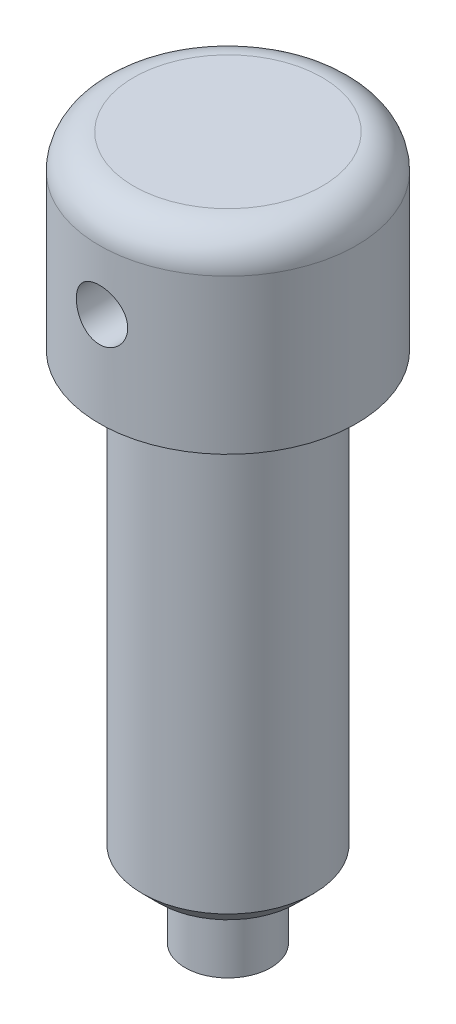
ISO-10303-21;
HEADER;
FILE_DESCRIPTION(('STEP AP214'),'2;1');
FILE_NAME('part.step','',(''),(''),'','','');
FILE_SCHEMA(('AUTOMOTIVE_DESIGN { 1 0 10303 214 1 1 1 1 }'));
ENDSEC;
DATA;
#1=APPLICATION_CONTEXT('core data for automotive mechanical design processes');
#2=APPLICATION_PROTOCOL_DEFINITION('international standard','automotive_design',2000,#1);
#3=PRODUCT_CONTEXT('',#1,'mechanical');
#4=PRODUCT('Part','Part','',(#3));
#5=PRODUCT_RELATED_PRODUCT_CATEGORY('part','',(#4));
#6=PRODUCT_DEFINITION_FORMATION('','',#4);
#7=PRODUCT_DEFINITION_CONTEXT('part definition',#1,'design');
#8=PRODUCT_DEFINITION('design','',#6,#7);
#9=PRODUCT_DEFINITION_SHAPE('','',#8);
#10=(LENGTH_UNIT() NAMED_UNIT(*) SI_UNIT(.MILLI.,.METRE.));
#11=(NAMED_UNIT(*) PLANE_ANGLE_UNIT() SI_UNIT($,.RADIAN.));
#12=(NAMED_UNIT(*) SI_UNIT($,.STERADIAN.) SOLID_ANGLE_UNIT());
#13=UNCERTAINTY_MEASURE_WITH_UNIT(LENGTH_MEASURE(1.E-05),#10,'distance_accuracy_value','');
#14=(GEOMETRIC_REPRESENTATION_CONTEXT(3) GLOBAL_UNCERTAINTY_ASSIGNED_CONTEXT((#13)) GLOBAL_UNIT_ASSIGNED_CONTEXT((#10,
#11,#12)) REPRESENTATION_CONTEXT('',''));
#15=CARTESIAN_POINT('',(0.,0.,0.));
#16=DIRECTION('',(0.,0.,1.));
#17=DIRECTION('',(1.,0.,0.));
#18=AXIS2_PLACEMENT_3D('',#15,#16,#17);
#19=CARTESIAN_POINT('',(0.,0.,0.));
#20=DIRECTION('',(0.,-1.,0.));
#21=DIRECTION('',(0.,0.,-1.));
#22=AXIS2_PLACEMENT_3D('',#19,#20,#21);
#23=CYLINDRICAL_SURFACE('',#22,7.49999999999999);
#24=CARTESIAN_POINT('',(0.,39.,0.));
#25=DIRECTION('',(0.,-1.,0.));
#26=DIRECTION('',(0.,0.,-1.));
#27=AXIS2_PLACEMENT_3D('',#24,#25,#26);
#28=CIRCLE('',#27,7.49999999999999);
#29=CARTESIAN_POINT('',(0.,39.,-7.49999999999999));
#30=VERTEX_POINT('',#29);
#31=EDGE_CURVE('E43',#30,#30,#28,.T.);
#32=ORIENTED_EDGE('',*,*,#31,.T.);
#33=EDGE_LOOP('',(#32));
#34=FACE_BOUND('',#33,.T.);
#35=CARTESIAN_POINT('',(0.,37.,-7.49999999999999));
#36=CARTESIAN_POINT('',(0.0833653601889498,36.9999969332525,-7.49999846371306));
#37=CARTESIAN_POINT('',(0.166769490302283,36.9930267355485,-7.49859577767346));
#38=CARTESIAN_POINT('',(0.331220261533529,36.9653522498271,-7.49313548434846));
#39=CARTESIAN_POINT('',(0.412264976312034,36.9446370507977,-7.48907576790279));
#40=CARTESIAN_POINT('',(0.56959545789497,36.8901380895688,-7.4787547391743));
#41=CARTESIAN_POINT('',(0.645885701899701,36.856366844733,-7.47249553615077));
#42=CARTESIAN_POINT('',(0.791711983296339,36.7767516287331,-7.45845597052971));
#43=CARTESIAN_POINT('',(0.86124842261372,36.7309083765892,-7.4506756985356));
#44=CARTESIAN_POINT('',(0.9925402159723,36.6277922585628,-7.43433247994954));
#45=CARTESIAN_POINT('',(1.05419092673779,36.5703874669132,-7.4257611825652));
#46=CARTESIAN_POINT('',(1.16705513491204,36.4460613754124,-7.40886270678882));
#47=CARTESIAN_POINT('',(1.21826781715564,36.3791393329973,-7.40053554750635));
#48=CARTESIAN_POINT('',(1.30924763002143,36.2369257104822,-7.38498662718922));
#49=CARTESIAN_POINT('',(1.3489064082988,36.1615635343055,-7.37777561047418));
#50=CARTESIAN_POINT('',(1.41495849987046,36.0050772714939,-7.36539402087626));
#51=CARTESIAN_POINT('',(1.44135312365586,35.9239537549805,-7.36022324642942));
#52=CARTESIAN_POINT('',(1.47978794982724,35.7593734541381,-7.35259207878306));
#53=CARTESIAN_POINT('',(1.49201174693817,35.6759611837867,-7.35009705160781));
#54=CARTESIAN_POINT('',(1.50232819158918,35.5082352679535,-7.3479956259094));
#55=CARTESIAN_POINT('',(1.50042228407025,35.4239217155198,-7.3483889320176));
#56=CARTESIAN_POINT('',(1.48268185965273,35.2581298179685,-7.35198826722276));
#57=CARTESIAN_POINT('',(1.46705781036586,35.176627891559,-7.35515179288145));
#58=CARTESIAN_POINT('',(1.42265682693458,35.0174258850055,-7.36386819240001));
#59=CARTESIAN_POINT('',(1.39387926465102,34.9397259866215,-7.36942118036667));
#60=CARTESIAN_POINT('',(1.32378717551208,34.7897271074446,-7.38233427750611));
#61=CARTESIAN_POINT('',(1.28238922684817,34.7174681806462,-7.38970634720556));
#62=CARTESIAN_POINT('',(1.18829036185902,34.5808437250408,-7.40541928159592));
#63=CARTESIAN_POINT('',(1.13558814653524,34.5164791047233,-7.41376025757548));
#64=CARTESIAN_POINT('',(1.01924990184088,34.3962558963146,-7.43065531862192));
#65=CARTESIAN_POINT('',(0.955434241818668,34.3405711482113,-7.43921053816357));
#66=CARTESIAN_POINT('',(0.819277536093017,34.2406692305482,-7.45543273071612));
#67=CARTESIAN_POINT('',(0.746936381069085,34.1964522080596,-7.4630996923346));
#68=CARTESIAN_POINT('',(0.595589080318383,34.120708736161,-7.4767003524133));
#69=CARTESIAN_POINT('',(0.516572729377951,34.0892021595332,-7.48263133272407));
#70=CARTESIAN_POINT('',(0.354223464672998,34.0399592889421,-7.49207113481787));
#71=CARTESIAN_POINT('',(0.270891075108676,34.0222213268896,-7.49558025000796));
#72=CARTESIAN_POINT('',(0.103769108440726,34.0012653193086,-7.49974007800301));
#73=CARTESIAN_POINT('',(0.0200104924883641,33.9978093706896,-7.50043761978704));
#74=CARTESIAN_POINT('',(-0.146887401289072,34.0048747884133,-7.49902577895153));
#75=CARTESIAN_POINT('',(-0.230026713665691,34.0153953690289,-7.49691655412169));
#76=CARTESIAN_POINT('',(-0.392558489919813,34.0499175603159,-7.49015748012026));
#77=CARTESIAN_POINT('',(-0.471977922509856,34.0737971027469,-7.48553064606309));
#78=CARTESIAN_POINT('',(-0.625685441249503,34.1342259739837,-7.47425328091548));
#79=CARTESIAN_POINT('',(-0.699973142456311,34.1707762520152,-7.46760259821339));
#80=CARTESIAN_POINT('',(-0.842311760529327,34.256023735977,-7.45289867299941));
#81=CARTESIAN_POINT('',(-0.910275190128281,34.3048641715584,-7.44482925655577));
#82=CARTESIAN_POINT('',(-1.03712702867881,34.4131137868109,-7.42822102244823));
#83=CARTESIAN_POINT('',(-1.09601446339615,34.4725240995998,-7.41968215452581));
#84=CARTESIAN_POINT('',(-1.20396088616127,34.6013100278367,-7.40293955335447));
#85=CARTESIAN_POINT('',(-1.25285655367299,34.670823616332,-7.39474290349956));
#86=CARTESIAN_POINT('',(-1.33827813007681,34.817217042035,-7.37976287694291));
#87=CARTESIAN_POINT('',(-1.37480453388436,34.8940965843603,-7.37297944370013));
#88=CARTESIAN_POINT('',(-1.43422776237294,35.0526523692243,-7.36165110876574));
#89=CARTESIAN_POINT('',(-1.45719524968658,35.1343012618155,-7.35709462308279));
#90=CARTESIAN_POINT('',(-1.4890629774408,35.3004001802364,-7.35071155188037));
#91=CARTESIAN_POINT('',(-1.49796505233767,35.384849839314,-7.34888461036666));
#92=CARTESIAN_POINT('',(-1.5013813663012,35.5525132968165,-7.34818724447068));
#93=CARTESIAN_POINT('',(-1.49615368210634,35.6357217233905,-7.34926378783951));
#94=CARTESIAN_POINT('',(-1.47202845615009,35.8000474748575,-7.3541336022692));
#95=CARTESIAN_POINT('',(-1.45313102419395,35.8811648165422,-7.35792685150753));
#96=CARTESIAN_POINT('',(-1.40231785274843,36.0388415668608,-7.36777896328737));
#97=CARTESIAN_POINT('',(-1.37043376007602,36.1154115407536,-7.37383231528245));
#98=CARTESIAN_POINT('',(-1.2945819669024,36.2621555811017,-7.38752572461255));
#99=CARTESIAN_POINT('',(-1.25061325316232,36.3323291105877,-7.39516591498341));
#100=CARTESIAN_POINT('',(-1.15095887217962,36.4655733582255,-7.41133440784838));
#101=CARTESIAN_POINT('',(-1.09508683085277,36.5285031479014,-7.41987559364549));
#102=CARTESIAN_POINT('',(-0.973596553519708,36.6441793082938,-7.43679122807931));
#103=CARTESIAN_POINT('',(-0.907976080729999,36.6969233354759,-7.44516563794776));
#104=CARTESIAN_POINT('',(-0.768026443632367,36.7912519659197,-7.46090748581957));
#105=CARTESIAN_POINT('',(-0.69361332664475,36.83271400492,-7.46826346828869));
#106=CARTESIAN_POINT('',(-0.538749541411096,36.9024791838949,-7.48102687627499));
#107=CARTESIAN_POINT('',(-0.458304391294686,36.9307941842987,-7.48643605707923));
#108=CARTESIAN_POINT('',(-0.314732233385668,36.9679779220671,-7.49364558893055));
#109=CARTESIAN_POINT('',(-0.252422496020676,36.9799647905616,-7.49601454737677));
#110=CARTESIAN_POINT('',(-0.1267492878151,36.9959768685375,-7.49919231209838));
#111=CARTESIAN_POINT('',(-0.0633858506229283,37.0000023317646,-7.50000116809732));
#112=CARTESIAN_POINT('',(0.,37.,-7.49999999999999));
#113=B_SPLINE_CURVE_WITH_KNOTS('',3,(#35,#36,#37,#38,#39,#40,#41,#42,#43,#44,#45,#46,#47,#48,
#49,#50,#51,#52,#53,#54,#55,#56,#57,#58,#59,#60,#61,#62,#63,#64,#65,#66,#67,#68,#69,#70,#71,#72,
#73,#74,#75,#76,#77,#78,#79,#80,#81,#82,#83,#84,#85,#86,#87,#88,#89,#90,#91,#92,#93,#94,#95,#96,
#97,#98,#99,#100,#101,#102,#103,#104,#105,#106,#107,#108,#109,#110,#111,#112),.UNSPECIFIED.,.T.,
.F.,(4,2,2,2,2,2,2,2,2,2,2,2,2,2,2,2,2,2,2,2,2,2,2,2,2,2,2,2,2,2,2,2,2,2,2,2,2,2,4),(0.,
0.249864195991887,0.499926976036985,0.749750602875514,0.999559353346297,1.25239900516828,
1.50525839512105,1.76041792508884,2.01555224047797,2.26734277655381,2.51910756421838,
2.76707590509418,3.01505608880595,3.26471235305389,3.51439732124507,3.76857378737026,
4.02275351309731,4.27732912281036,4.53187388547054,4.78216103514398,5.03243411486802,
5.28045680926086,5.52849808824034,5.77957599050039,6.03068082518896,6.2856094286884,
6.540527830852,6.79410571549086,7.04765052495623,7.29659583851554,7.54553915238914,
7.79387941879667,8.04224051372802,8.29482114358716,8.54745981799397,8.80274245013457,
9.05779433276279,9.24778162934842,9.43776287056495),.UNSPECIFIED.);
#114=CARTESIAN_POINT('',(0.,37.,-7.49999999999999));
#115=VERTEX_POINT('',#114);
#116=EDGE_CURVE('E55',#115,#115,#113,.T.);
#117=ORIENTED_EDGE('',*,*,#116,.F.);
#118=EDGE_LOOP('',(#117));
#119=FACE_BOUND('',#118,.T.);
#120=CARTESIAN_POINT('',(0.,30.,0.));
#121=DIRECTION('',(0.,-1.,0.));
#122=DIRECTION('',(0.,0.,-1.));
#123=AXIS2_PLACEMENT_3D('',#120,#121,#122);
#124=CIRCLE('',#123,7.49999999999999);
#125=CARTESIAN_POINT('',(0.,30.,-7.49999999999999));
#126=VERTEX_POINT('',#125);
#127=EDGE_CURVE('E104',#126,#126,#124,.T.);
#128=ORIENTED_EDGE('',*,*,#127,.F.);
#129=EDGE_LOOP('',(#128));
#130=FACE_BOUND('',#129,.T.);
#131=CARTESIAN_POINT('',(1.5,35.5,7.34846922834953));
#132=CARTESIAN_POINT('',(1.49999691881235,35.5833465632358,7.34847088538349));
#133=CARTESIAN_POINT('',(1.49302975757707,35.6667319349997,7.34990262402618));
#134=CARTESIAN_POINT('',(1.46536842537441,35.831143757715,7.35546646957746));
#135=CARTESIAN_POINT('',(1.44466327060578,35.912168266954,7.35960073717297));
#136=CARTESIAN_POINT('',(1.39019367392958,36.0694559550312,7.37008310582665));
#137=CARTESIAN_POINT('',(1.35644222122892,36.1457237822989,7.37642900431581));
#138=CARTESIAN_POINT('',(1.27687366150577,36.2915122670454,7.39061699221018));
#139=CARTESIAN_POINT('',(1.23105722790173,36.3610333008069,7.39845899810199));
#140=CARTESIAN_POINT('',(1.12796861348015,36.4923415057808,7.4148794954137));
#141=CARTESIAN_POINT('',(1.07055848386998,36.554019381826,7.42346606755867));
#142=CARTESIAN_POINT('',(0.946210183531967,36.6669363003685,7.44033708453899));
#143=CARTESIAN_POINT('',(0.879271345466978,36.7181746111258,7.44862150816247));
#144=CARTESIAN_POINT('',(0.737042033886386,36.8091820264427,7.46404194626342));
#145=CARTESIAN_POINT('',(0.661683851508319,36.848847270725,7.47116732162325));
#146=CARTESIAN_POINT('',(0.50520622558091,36.9149124055722,7.48337605325447));
#147=CARTESIAN_POINT('',(0.424087322130832,36.9413135378515,7.48845960066178));
#148=CARTESIAN_POINT('',(0.259525159917744,36.9797607904294,7.49595481032627));
#149=CARTESIAN_POINT('',(0.176126608822224,36.9919914663565,7.4984007943219));
#150=CARTESIAN_POINT('',(0.00842785265630768,37.0023264277575,7.50046381775405));
#151=CARTESIAN_POINT('',(-0.0758722647477615,37.0004320744687,7.50008112979138));
#152=CARTESIAN_POINT('',(-0.241713001115379,36.9827107296767,7.49655652302773));
#153=CARTESIAN_POINT('',(-0.323275821447701,36.9670825342482,7.49345397548757));
#154=CARTESIAN_POINT('',(-0.482597439870447,36.9226524513117,7.48488265739112));
#155=CARTESIAN_POINT('',(-0.56035608562069,36.8938500367122,7.47941379216058));
#156=CARTESIAN_POINT('',(-0.710429194801327,36.8237049397791,7.46665944029937));
#157=CARTESIAN_POINT('',(-0.782706261200846,36.7822843733427,7.45936272262835));
#158=CARTESIAN_POINT('',(-0.91935756878963,36.6881363841451,7.44375704210677));
#159=CARTESIAN_POINT('',(-0.983730899287497,36.6354076603442,7.43544796282833));
#160=CARTESIAN_POINT('',(-1.10392714658018,36.5190495668373,7.41856446546689));
#161=CARTESIAN_POINT('',(-1.15958147486045,36.4552462199056,7.40998794686273));
#162=CARTESIAN_POINT('',(-1.25942773976521,36.3191253363239,7.3936735739814));
#163=CARTESIAN_POINT('',(-1.30361945959163,36.2468076386752,7.38593573556822));
#164=CARTESIAN_POINT('',(-1.37934422220282,36.0954687522673,7.37217071209385));
#165=CARTESIAN_POINT('',(-1.41084997166657,36.0164335485405,7.36614722345323));
#166=CARTESIAN_POINT('',(-1.46008551244137,35.854043014414,7.35654714481909));
#167=CARTESIAN_POINT('',(-1.47781709918496,35.7706882485714,7.35297023592641));
#168=CARTESIAN_POINT('',(-1.49874900905408,35.6035527130014,7.34873218901741));
#169=CARTESIAN_POINT('',(-1.50219278834687,35.5198036385345,7.34802220585731));
#170=CARTESIAN_POINT('',(-1.49510644246611,35.3529276652005,7.3494672853328));
#171=CARTESIAN_POINT('',(-1.48457710968366,35.2698007313217,7.35162218550581));
#172=CARTESIAN_POINT('',(-1.45005331211124,35.1073470395617,7.35850848742371));
#173=CARTESIAN_POINT('',(-1.42618893125895,35.0279914854464,7.36321498521744));
#174=CARTESIAN_POINT('',(-1.36581155296278,34.8744050814569,7.37465234027496));
#175=CARTESIAN_POINT('',(-1.32929751355977,34.8001746543464,7.38138336429404));
#176=CARTESIAN_POINT('',(-1.2441062133234,34.6578803350748,7.39622108943059));
#177=CARTESIAN_POINT('',(-1.19527661697413,34.5899094305488,7.40434457797354));
#178=CARTESIAN_POINT('',(-1.08704335831907,34.4630375319986,7.42100585739954));
#179=CARTESIAN_POINT('',(-1.02763860771681,34.4041374726261,7.42954369085726));
#180=CARTESIAN_POINT('',(-0.898848410246841,34.2961561612216,7.44623018803823));
#181=CARTESIAN_POINT('',(-0.829323748394453,34.247239518025,7.45437086563025));
#182=CARTESIAN_POINT('',(-0.682901844952143,34.1617811777506,7.46920691442929));
#183=CARTESIAN_POINT('',(-0.606004913150267,34.1252389609828,7.47590234632816));
#184=CARTESIAN_POINT('',(-0.447454021236023,34.06580669238,7.487059410916));
#185=CARTESIAN_POINT('',(-0.36583001021712,34.0428392226606,7.49153368713906));
#186=CARTESIAN_POINT('',(-0.199784182019871,34.0109631285042,7.4977985390649));
#187=CARTESIAN_POINT('',(-0.115362703066824,34.0020528107865,7.49958943799764));
#188=CARTESIAN_POINT('',(0.0523093408554319,33.9986095285557,7.50027810681181));
#189=CARTESIAN_POINT('',(0.13555471821225,34.0038290793157,7.49922567824026));
#190=CARTESIAN_POINT('',(0.299956546973458,34.0279509258217,7.49445065340476));
#191=CARTESIAN_POINT('',(0.381113024630533,34.0468530495221,7.49072809071527));
#192=CARTESIAN_POINT('',(0.538879124617641,34.0976934881375,7.48103247547499));
#193=CARTESIAN_POINT('',(0.615498664860418,34.1296020671968,7.47506455871865));
#194=CARTESIAN_POINT('',(0.762331830278926,34.2055183619963,7.46152083185076));
#195=CARTESIAN_POINT('',(0.832544948651114,34.2495270338556,7.45394489468827));
#196=CARTESIAN_POINT('',(0.965795835159534,34.3492290805931,7.4378639873679));
#197=CARTESIAN_POINT('',(1.02869957417475,34.4050995045802,7.42934600133169));
#198=CARTESIAN_POINT('',(1.14432392663527,34.5265753601436,7.41241834355477));
#199=CARTESIAN_POINT('',(1.19704212480408,34.5921830942031,7.40400869794476));
#200=CARTESIAN_POINT('',(1.29133832918279,34.7321189750503,7.3881501412478));
#201=CARTESIAN_POINT('',(1.33279022195961,34.8065334417407,7.38071255446371));
#202=CARTESIAN_POINT('',(1.40253607393175,34.9613991599494,7.36777855777286));
#203=CARTESIAN_POINT('',(1.43084196896908,35.0418448580463,7.36228038807748));
#204=CARTESIAN_POINT('',(1.4680037097813,35.1853936831552,7.35494521691659));
#205=CARTESIAN_POINT('',(1.47998084778413,35.2476781292685,7.35253177367824));
#206=CARTESIAN_POINT('',(1.49598002694097,35.3733009318291,7.3492931769271));
#207=CARTESIAN_POINT('',(1.50000234234439,35.4366392518674,7.34846796865858));
#208=CARTESIAN_POINT('',(1.5,35.5,7.34846922834953));
#209=B_SPLINE_CURVE_WITH_KNOTS('',3,(#131,#132,#133,#134,#135,#136,#137,#138,#139,#140,#141,
#142,#143,#144,#145,#146,#147,#148,#149,#150,#151,#152,#153,#154,#155,#156,#157,#158,#159,#160,
#161,#162,#163,#164,#165,#166,#167,#168,#169,#170,#171,#172,#173,#174,#175,#176,#177,#178,#179,
#180,#181,#182,#183,#184,#185,#186,#187,#188,#189,#190,#191,#192,#193,#194,#195,#196,#197,#198,
#199,#200,#201,#202,#203,#204,#205,#206,#207,#208),.UNSPECIFIED.,.T.,.F.,(4,2,2,2,2,2,2,2,2,2,2,
2,2,2,2,2,2,2,2,2,2,2,2,2,2,2,2,2,2,2,2,2,2,2,2,2,2,2,4),(0.,0.249807695804142,
0.499815358926442,0.749574746910876,0.999320197289795,1.25223378822656,1.50516510053133,
1.76030100656175,2.0154130236984,2.26716373324621,2.51889018174372,2.76703184450306,
3.01518343610625,3.26489886333455,3.51464303655099,3.76874020143726,4.02284217184081,
4.27748794759166,4.53210052524038,4.78235636706891,5.03259801792633,5.28044012674978,
5.52830265531598,5.77939589661782,6.03051499305313,6.28548902600176,6.54045234945157,
6.79394720367976,7.04741152037442,7.29646526122029,7.54551587050135,7.79400025613178,
8.04250428202027,8.29501728038396,8.54759008334672,8.80288347868562,9.057944626334,
9.24785705455344,9.43776293526323),.UNSPECIFIED.);
#210=CARTESIAN_POINT('',(1.5,35.5,7.34846922834953));
#211=VERTEX_POINT('',#210);
#212=EDGE_CURVE('E48',#211,#211,#209,.T.);
#213=ORIENTED_EDGE('',*,*,#212,.F.);
#214=EDGE_LOOP('',(#213));
#215=FACE_BOUND('',#214,.T.);
#216=ADVANCED_FACE('F28',(#34,#119,#130,#215),#23,.T.);
#217=CARTESIAN_POINT('',(0.,41.,0.));
#218=DIRECTION('',(0.,-1.,0.));
#219=DIRECTION('',(0.,0.,-1.));
#220=AXIS2_PLACEMENT_3D('',#217,#218,#219);
#221=PLANE('',#220);
#222=CARTESIAN_POINT('',(0.,41.,0.));
#223=DIRECTION('',(0.,-1.,0.));
#224=DIRECTION('',(0.,0.,-1.));
#225=AXIS2_PLACEMENT_3D('',#222,#223,#224);
#226=CIRCLE('',#225,5.49999999999999);
#227=CARTESIAN_POINT('',(0.,41.,-5.49999999999999));
#228=VERTEX_POINT('',#227);
#229=EDGE_CURVE('E39',#228,#228,#226,.F.);
#230=ORIENTED_EDGE('',*,*,#229,.T.);
#231=EDGE_LOOP('',(#230));
#232=FACE_BOUND('',#231,.T.);
#233=ADVANCED_FACE('F84',(#232),#221,.F.);
#234=CARTESIAN_POINT('',(0.,30.,7.49999999999999));
#235=DIRECTION('',(0.,1.,0.));
#236=DIRECTION('',(0.,0.,1.));
#237=AXIS2_PLACEMENT_3D('',#234,#235,#236);
#238=PLANE('',#237);
#239=CARTESIAN_POINT('',(0.,30.,0.));
#240=DIRECTION('',(0.,-1.,0.));
#241=DIRECTION('',(0.,0.,-1.));
#242=AXIS2_PLACEMENT_3D('',#239,#240,#241);
#243=CIRCLE('',#242,5.);
#244=CARTESIAN_POINT('',(0.,30.,-5.));
#245=VERTEX_POINT('',#244);
#246=EDGE_CURVE('E107',#245,#245,#243,.T.);
#247=ORIENTED_EDGE('',*,*,#246,.F.);
#248=EDGE_LOOP('',(#247));
#249=FACE_BOUND('',#248,.T.);
#250=ORIENTED_EDGE('',*,*,#127,.T.);
#251=EDGE_LOOP('',(#250));
#252=FACE_BOUND('',#251,.T.);
#253=ADVANCED_FACE('F82',(#249,#252),#238,.F.);
#254=CARTESIAN_POINT('',(0.,0.,0.));
#255=DIRECTION('',(0.,-1.,0.));
#256=DIRECTION('',(0.,0.,-1.));
#257=AXIS2_PLACEMENT_3D('',#254,#255,#256);
#258=CYLINDRICAL_SURFACE('',#257,5.);
#259=CARTESIAN_POINT('',(0.,5.,0.));
#260=DIRECTION('',(0.,1.,0.));
#261=DIRECTION('',(0.,0.,1.));
#262=AXIS2_PLACEMENT_3D('',#259,#260,#261);
#263=CIRCLE('',#262,5.);
#264=CARTESIAN_POINT('',(0.,5.,5.));
#265=VERTEX_POINT('',#264);
#266=EDGE_CURVE('E10',#265,#265,#263,.T.);
#267=ORIENTED_EDGE('',*,*,#266,.T.);
#268=EDGE_LOOP('',(#267));
#269=FACE_BOUND('',#268,.T.);
#270=ORIENTED_EDGE('',*,*,#246,.T.);
#271=EDGE_LOOP('',(#270));
#272=FACE_BOUND('',#271,.T.);
#273=ADVANCED_FACE('F80',(#269,#272),#258,.T.);
#274=CARTESIAN_POINT('',(0.,4.,4.99999999999999));
#275=DIRECTION('',(0.,1.,0.));
#276=DIRECTION('',(0.,0.,1.));
#277=AXIS2_PLACEMENT_3D('',#274,#275,#276);
#278=PLANE('',#277);
#279=CARTESIAN_POINT('',(0.,4.,0.));
#280=DIRECTION('',(0.,1.,0.));
#281=DIRECTION('',(0.,0.,1.));
#282=AXIS2_PLACEMENT_3D('',#279,#280,#281);
#283=CIRCLE('',#282,4.);
#284=CARTESIAN_POINT('',(0.,4.,4.));
#285=VERTEX_POINT('',#284);
#286=EDGE_CURVE('E35',#285,#285,#283,.F.);
#287=ORIENTED_EDGE('',*,*,#286,.T.);
#288=EDGE_LOOP('',(#287));
#289=FACE_BOUND('',#288,.T.);
#290=CARTESIAN_POINT('',(0.,4.,0.));
#291=DIRECTION('',(0.,-1.,0.));
#292=DIRECTION('',(0.,0.,-1.));
#293=AXIS2_PLACEMENT_3D('',#290,#291,#292);
#294=CIRCLE('',#293,2.5);
#295=CARTESIAN_POINT('',(0.,4.,-2.5));
#296=VERTEX_POINT('',#295);
#297=EDGE_CURVE('E109',#296,#296,#294,.T.);
#298=ORIENTED_EDGE('',*,*,#297,.F.);
#299=EDGE_LOOP('',(#298));
#300=FACE_BOUND('',#299,.T.);
#301=ADVANCED_FACE('F76',(#289,#300),#278,.F.);
#302=CARTESIAN_POINT('',(0.,0.,0.));
#303=DIRECTION('',(0.,-1.,0.));
#304=DIRECTION('',(0.,0.,-1.));
#305=AXIS2_PLACEMENT_3D('',#302,#303,#304);
#306=CYLINDRICAL_SURFACE('',#305,2.5);
#307=CARTESIAN_POINT('',(0.,0.,0.));
#308=DIRECTION('',(0.,-1.,0.));
#309=DIRECTION('',(0.,0.,-1.));
#310=AXIS2_PLACEMENT_3D('',#307,#308,#309);
#311=CIRCLE('',#310,2.5);
#312=CARTESIAN_POINT('',(0.,0.,-2.5));
#313=VERTEX_POINT('',#312);
#314=EDGE_CURVE('E114',#313,#313,#311,.T.);
#315=ORIENTED_EDGE('',*,*,#314,.F.);
#316=EDGE_LOOP('',(#315));
#317=FACE_BOUND('',#316,.T.);
#318=ORIENTED_EDGE('',*,*,#297,.T.);
#319=EDGE_LOOP('',(#318));
#320=FACE_BOUND('',#319,.T.);
#321=ADVANCED_FACE('F72',(#317,#320),#306,.T.);
#322=CARTESIAN_POINT('',(0.,0.,2.5));
#323=DIRECTION('',(0.,1.,0.));
#324=DIRECTION('',(0.,0.,1.));
#325=AXIS2_PLACEMENT_3D('',#322,#323,#324);
#326=PLANE('',#325);
#327=ORIENTED_EDGE('',*,*,#314,.T.);
#328=EDGE_LOOP('',(#327));
#329=FACE_BOUND('',#328,.T.);
#330=ADVANCED_FACE('F67',(#329),#326,.F.);
#331=CARTESIAN_POINT('',(0.,35.5,7.49999999999999));
#332=DIRECTION('',(0.,0.,1.));
#333=DIRECTION('',(1.,0.,0.));
#334=AXIS2_PLACEMENT_3D('',#331,#332,#333);
#335=CYLINDRICAL_SURFACE('',#334,1.5);
#336=ORIENTED_EDGE('',*,*,#212,.T.);
#337=EDGE_LOOP('',(#336));
#338=FACE_BOUND('',#337,.T.);
#339=ORIENTED_EDGE('',*,*,#116,.T.);
#340=EDGE_LOOP('',(#339));
#341=FACE_BOUND('',#340,.T.);
#342=ADVANCED_FACE('F62',(#338,#341),#335,.F.);
#343=CARTESIAN_POINT('',(0.,39.,0.));
#344=DIRECTION('',(0.,-1.,0.));
#345=DIRECTION('',(0.,0.,-1.));
#346=AXIS2_PLACEMENT_3D('',#343,#344,#345);
#347=TOROIDAL_SURFACE('',#346,5.49999999999999,2.);
#348=ORIENTED_EDGE('',*,*,#229,.F.);
#349=EDGE_LOOP('',(#348));
#350=FACE_BOUND('',#349,.T.);
#351=ORIENTED_EDGE('',*,*,#31,.F.);
#352=EDGE_LOOP('',(#351));
#353=FACE_BOUND('',#352,.T.);
#354=ADVANCED_FACE('F66',(#350,#353),#347,.T.);
#355=CARTESIAN_POINT('',(0.,4.,0.));
#356=DIRECTION('',(0.,1.,0.));
#357=DIRECTION('',(0.,0.,1.));
#358=AXIS2_PLACEMENT_3D('',#355,#356,#357);
#359=CONICAL_SURFACE('',#358,4.,0.785398163397443);
#360=ORIENTED_EDGE('',*,*,#266,.F.);
#361=EDGE_LOOP('',(#360));
#362=FACE_BOUND('',#361,.T.);
#363=ORIENTED_EDGE('',*,*,#286,.F.);
#364=EDGE_LOOP('',(#363));
#365=FACE_BOUND('',#364,.T.);
#366=ADVANCED_FACE('F30',(#362,#365),#359,.T.);
#367=CLOSED_SHELL('',(#216,#233,#253,#273,#301,#321,#330,#342,#354,#366));
#368=MANIFOLD_SOLID_BREP('B2',#367);
#369=ADVANCED_BREP_SHAPE_REPRESENTATION('',(#18,#368),#14);
#370=SHAPE_DEFINITION_REPRESENTATION(#9,#369);
ENDSEC;
END-ISO-10303-21;
